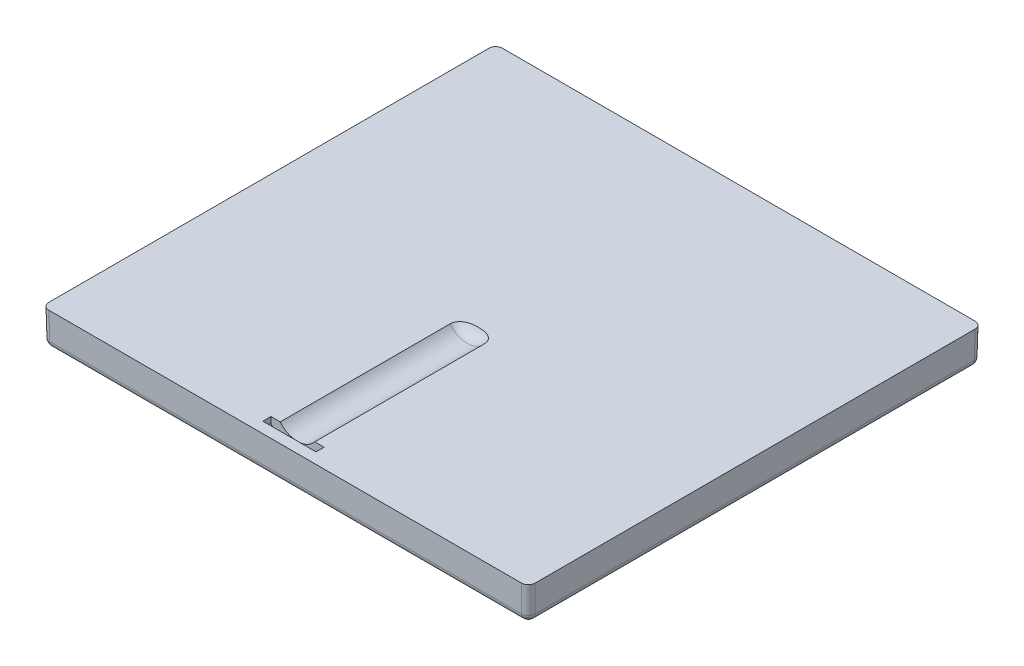
ISO-10303-21;
HEADER;
FILE_DESCRIPTION(('STEP AP214'),'2;1');
FILE_NAME('part.step','',(''),(''),'','','');
FILE_SCHEMA(('AUTOMOTIVE_DESIGN { 1 0 10303 214 1 1 1 1 }'));
ENDSEC;
DATA;
#1=APPLICATION_CONTEXT('core data for automotive mechanical design processes');
#2=APPLICATION_PROTOCOL_DEFINITION('international standard','automotive_design',2000,#1);
#3=PRODUCT_CONTEXT('',#1,'mechanical');
#4=PRODUCT('Part','Part','',(#3));
#5=PRODUCT_RELATED_PRODUCT_CATEGORY('part','',(#4));
#6=PRODUCT_DEFINITION_FORMATION('','',#4);
#7=PRODUCT_DEFINITION_CONTEXT('part definition',#1,'design');
#8=PRODUCT_DEFINITION('design','',#6,#7);
#9=PRODUCT_DEFINITION_SHAPE('','',#8);
#10=(LENGTH_UNIT() NAMED_UNIT(*) SI_UNIT(.MILLI.,.METRE.));
#11=(NAMED_UNIT(*) PLANE_ANGLE_UNIT() SI_UNIT($,.RADIAN.));
#12=(NAMED_UNIT(*) SI_UNIT($,.STERADIAN.) SOLID_ANGLE_UNIT());
#13=UNCERTAINTY_MEASURE_WITH_UNIT(LENGTH_MEASURE(1.E-05),#10,'distance_accuracy_value','');
#14=(GEOMETRIC_REPRESENTATION_CONTEXT(3) GLOBAL_UNCERTAINTY_ASSIGNED_CONTEXT((#13)) GLOBAL_UNIT_ASSIGNED_CONTEXT((#10,
#11,#12)) REPRESENTATION_CONTEXT('',''));
#15=CARTESIAN_POINT('',(0.,0.,0.));
#16=DIRECTION('',(0.,0.,1.));
#17=DIRECTION('',(1.,0.,0.));
#18=AXIS2_PLACEMENT_3D('',#15,#16,#17);
#19=CARTESIAN_POINT('',(0.,15.,0.));
#20=DIRECTION('',(0.,-1.,0.));
#21=DIRECTION('',(0.,0.,-1.));
#22=AXIS2_PLACEMENT_3D('',#19,#20,#21);
#23=PLANE('',#22);
#24=DIRECTION('',(1.,0.,0.));
#25=VECTOR('',#24,1.);
#26=CARTESIAN_POINT('',(0.,15.,-100.761825973923));
#27=LINE('',#26,#25);
#28=CARTESIAN_POINT('',(105.012282888454,15.,-100.761825973923));
#29=VERTEX_POINT('',#28);
#30=CARTESIAN_POINT('',(-105.012282888454,15.,-100.761825973923));
#31=VERTEX_POINT('',#30);
#32=EDGE_CURVE('E221',#29,#31,#27,.F.);
#33=ORIENTED_EDGE('',*,*,#32,.T.);
#34=CARTESIAN_POINT('',(-105.011368989792,15.,-97.7613689897915));
#35=DIRECTION('',(0.,-1.,0.));
#36=DIRECTION('',(0.707106781186548,0.,0.707106781186548));
#37=AXIS2_PLACEMENT_3D('',#34,#35,#36);
#38=ELLIPSE('',#37,3.00091389867315,3.);
#39=CARTESIAN_POINT('',(-108.011825973923,15.,-97.7622828884541));
#40=VERTEX_POINT('',#39);
#41=EDGE_CURVE('E259',#31,#40,#38,.F.);
#42=ORIENTED_EDGE('',*,*,#41,.T.);
#43=DIRECTION('',(0.,0.,-1.));
#44=VECTOR('',#43,1.);
#45=CARTESIAN_POINT('',(-108.011825973923,15.,0.));
#46=LINE('',#45,#44);
#47=CARTESIAN_POINT('',(-108.011825973923,15.,97.7622828884541));
#48=VERTEX_POINT('',#47);
#49=EDGE_CURVE('E225',#40,#48,#46,.F.);
#50=ORIENTED_EDGE('',*,*,#49,.T.);
#51=CARTESIAN_POINT('',(-105.011368989792,15.,97.7613689897916));
#52=DIRECTION('',(0.,-1.,0.));
#53=DIRECTION('',(0.707106781186548,0.,-0.707106781186548));
#54=AXIS2_PLACEMENT_3D('',#51,#52,#53);
#55=ELLIPSE('',#54,3.00091389867315,3.);
#56=CARTESIAN_POINT('',(-105.012282888454,15.,100.761825973923));
#57=VERTEX_POINT('',#56);
#58=EDGE_CURVE('E253',#48,#57,#55,.F.);
#59=ORIENTED_EDGE('',*,*,#58,.T.);
#60=DIRECTION('',(-1.,0.,0.));
#61=VECTOR('',#60,1.);
#62=CARTESIAN_POINT('',(0.,15.,100.761825973923));
#63=LINE('',#62,#61);
#64=CARTESIAN_POINT('',(105.012282888454,15.,100.761825973923));
#65=VERTEX_POINT('',#64);
#66=EDGE_CURVE('E228',#57,#65,#63,.F.);
#67=ORIENTED_EDGE('',*,*,#66,.T.);
#68=CARTESIAN_POINT('',(105.011368989792,15.,97.7613689897916));
#69=DIRECTION('',(0.,-1.,0.));
#70=DIRECTION('',(-0.707106781186548,0.,-0.707106781186548));
#71=AXIS2_PLACEMENT_3D('',#68,#69,#70);
#72=ELLIPSE('',#71,3.00091389867315,3.);
#73=CARTESIAN_POINT('',(108.011825973923,15.,97.7622828884541));
#74=VERTEX_POINT('',#73);
#75=EDGE_CURVE('E255',#65,#74,#72,.F.);
#76=ORIENTED_EDGE('',*,*,#75,.T.);
#77=DIRECTION('',(0.,0.,1.));
#78=VECTOR('',#77,1.);
#79=CARTESIAN_POINT('',(108.011825973923,15.,0.));
#80=LINE('',#79,#78);
#81=CARTESIAN_POINT('',(108.011825973923,15.,-97.7622828884541));
#82=VERTEX_POINT('',#81);
#83=EDGE_CURVE('E218',#74,#82,#80,.F.);
#84=ORIENTED_EDGE('',*,*,#83,.T.);
#85=CARTESIAN_POINT('',(105.011368989792,15.,-97.7613689897915));
#86=DIRECTION('',(0.,-1.,0.));
#87=DIRECTION('',(-0.707106781186548,0.,0.707106781186548));
#88=AXIS2_PLACEMENT_3D('',#85,#86,#87);
#89=ELLIPSE('',#88,3.00091389867315,3.);
#90=EDGE_CURVE('E257',#82,#29,#89,.F.);
#91=ORIENTED_EDGE('',*,*,#90,.T.);
#92=EDGE_LOOP('',(#33,#42,#50,#59,#67,#76,#84,#91));
#93=FACE_BOUND('',#92,.T.);
#94=DIRECTION('',(-1.,0.,0.));
#95=VECTOR('',#94,1.);
#96=CARTESIAN_POINT('',(0.,15.,92.3598238072773));
#97=LINE('',#96,#95);
#98=CARTESIAN_POINT('',(8.86054151823812,15.,92.3598238072773));
#99=VERTEX_POINT('',#98);
#100=CARTESIAN_POINT('',(4.71373386781985,15.,92.3598238072773));
#101=VERTEX_POINT('',#100);
#102=EDGE_CURVE('E11',#99,#101,#97,.T.);
#103=ORIENTED_EDGE('',*,*,#102,.F.);
#104=DIRECTION('',(0.,0.,-1.));
#105=VECTOR('',#104,1.);
#106=CARTESIAN_POINT('',(8.86054151823821,15.,0.));
#107=LINE('',#106,#105);
#108=CARTESIAN_POINT('',(8.86054151823812,15.,95.9298238072773));
#109=VERTEX_POINT('',#108);
#110=EDGE_CURVE('E310',#109,#99,#107,.T.);
#111=ORIENTED_EDGE('',*,*,#110,.F.);
#112=DIRECTION('',(-1.,0.,0.));
#113=VECTOR('',#112,1.);
#114=CARTESIAN_POINT('',(0.,15.,95.9298238072773));
#115=LINE('',#114,#113);
#116=CARTESIAN_POINT('',(-14.7644584817619,15.,95.9298238072772));
#117=VERTEX_POINT('',#116);
#118=EDGE_CURVE('E308',#109,#117,#115,.T.);
#119=ORIENTED_EDGE('',*,*,#118,.T.);
#120=DIRECTION('',(0.,0.,1.));
#121=VECTOR('',#120,1.);
#122=CARTESIAN_POINT('',(-14.7644584817618,15.,0.));
#123=LINE('',#122,#121);
#124=CARTESIAN_POINT('',(-14.7644584817619,15.,92.3598238072773));
#125=VERTEX_POINT('',#124);
#126=EDGE_CURVE('E170',#125,#117,#123,.T.);
#127=ORIENTED_EDGE('',*,*,#126,.F.);
#128=CARTESIAN_POINT('',(-10.6176508313436,15.,92.3598238072772));
#129=VERTEX_POINT('',#128);
#130=EDGE_CURVE('E47',#129,#125,#97,.T.);
#131=ORIENTED_EDGE('',*,*,#130,.F.);
#132=DIRECTION('',(0.,0.,-1.));
#133=VECTOR('',#132,1.);
#134=CARTESIAN_POINT('',(-10.6176508313435,15.,9.51235226495935));
#135=LINE('',#134,#133);
#136=CARTESIAN_POINT('',(-10.6176508313435,15.,16.9308080825));
#137=VERTEX_POINT('',#136);
#138=EDGE_CURVE('E305',#129,#137,#135,.T.);
#139=ORIENTED_EDGE('',*,*,#138,.T.);
#140=CARTESIAN_POINT('',(-2.95195848176181,15.,11.9296754535707));
#141=CARTESIAN_POINT('',(-2.79431894258142,15.,11.9296763348828));
#142=CARTESIAN_POINT('',(-2.6366804209323,15.,11.9315816788477));
#143=CARTESIAN_POINT('',(-2.32149308863841,15.,11.9393103763381));
#144=CARTESIAN_POINT('',(-2.16394428097352,15.,11.9451338531827));
#145=CARTESIAN_POINT('',(-1.84897882301656,15.,11.9610081069492));
#146=CARTESIAN_POINT('',(-1.69156226899235,15.,11.9710608596316));
#147=CARTESIAN_POINT('',(-1.37710376476,15.,11.9958872574424));
#148=CARTESIAN_POINT('',(-1.22006182796372,15.,12.0106610691101));
#149=CARTESIAN_POINT('',(-0.750709675648307,15.,12.0629011727345));
#150=CARTESIAN_POINT('',(-0.439199367883631,15.,12.1083278601685));
#151=CARTESIAN_POINT('',(0.17833625615687,15.,12.2266224152269));
#152=CARTESIAN_POINT('',(0.484367614252867,15.,12.2994578199985));
#153=CARTESIAN_POINT('',(1.09542288757707,15.,12.4821063947428));
#154=CARTESIAN_POINT('',(1.40015872755473,15.,12.5929332581364));
#155=CARTESIAN_POINT('',(1.84300865395335,15.,12.7910003325152));
#156=CARTESIAN_POINT('',(1.98830010150553,15.,12.8623590281029));
#157=CARTESIAN_POINT('',(2.27282473649055,15.,13.0162250241725));
#158=CARTESIAN_POINT('',(2.41206057197358,15.,13.0987273855184));
#159=CARTESIAN_POINT('',(2.68471777114792,15.,13.276322051727));
#160=CARTESIAN_POINT('',(2.81804746090716,15.,13.3715556897657));
#161=CARTESIAN_POINT('',(3.07533981860293,15.,13.5738480727472));
#162=CARTESIAN_POINT('',(3.19930741697665,15.,13.6809005192784));
#163=CARTESIAN_POINT('',(3.43618347158802,15.,13.9066118308448));
#164=CARTESIAN_POINT('',(3.54909376407961,15.,14.0252687621939));
#165=CARTESIAN_POINT('',(3.76208054171551,15.,14.2735985226301));
#166=CARTESIAN_POINT('',(3.86215956224103,15.,14.4032691670302));
#167=CARTESIAN_POINT('',(4.0359335067752,15.,14.65549205548));
#168=CARTESIAN_POINT('',(4.11136530966199,15.,14.7768493234994));
#169=CARTESIAN_POINT('',(4.25005788883109,15.,15.0263232682753));
#170=CARTESIAN_POINT('',(4.31332093985722,15.,15.1544386759942));
#171=CARTESIAN_POINT('',(4.42668165287631,15.,15.416259072217));
#172=CARTESIAN_POINT('',(4.47678932947434,15.,15.5499597185222));
#173=CARTESIAN_POINT('',(4.56309942788821,15.,15.821772832174));
#174=CARTESIAN_POINT('',(4.59930398029772,15.,15.9598846200156));
#175=CARTESIAN_POINT('',(4.65284029360923,15.,16.2179884453307));
#176=CARTESIAN_POINT('',(4.67219738134023,15.,16.3375643977274));
#177=CARTESIAN_POINT('',(4.70024464212918,15.,16.5780051386266));
#178=CARTESIAN_POINT('',(4.70893162637094,15.,16.6988703015362));
#179=CARTESIAN_POINT('',(4.71551550404964,15.,16.9408030792257));
#180=CARTESIAN_POINT('',(4.71342040219353,15.,17.0618704771275));
#181=CARTESIAN_POINT('',(4.69848331618409,15.,17.3033841021608));
#182=CARTESIAN_POINT('',(4.68563742082758,15.,17.4238300871706));
#183=CARTESIAN_POINT('',(4.65026367362728,15.,17.6570754317746));
#184=CARTESIAN_POINT('',(4.62825712427902,15.,17.7699539416243));
#185=CARTESIAN_POINT('',(4.57493850025328,15.,17.9935038263437));
#186=CARTESIAN_POINT('',(4.54362321034528,15.,18.1041744244857));
#187=CARTESIAN_POINT('',(4.43620068220537,15.,18.4316424082741));
#188=CARTESIAN_POINT('',(4.34657620597815,15.,18.644158552461));
#189=CARTESIAN_POINT('',(4.13228120187006,15.,19.0574529969159));
#190=CARTESIAN_POINT('',(4.00677051594731,15.,19.257790258984));
#191=CARTESIAN_POINT('',(3.72654727540496,15.,19.6369245866604));
#192=CARTESIAN_POINT('',(3.57181738892789,15.,19.8157087640432));
#193=CARTESIAN_POINT('',(3.22273595873922,15.,20.1650718094159));
#194=CARTESIAN_POINT('',(3.02602159082608,15.,20.3332772541423));
#195=CARTESIAN_POINT('',(2.61102233249258,15.,20.639943725502));
#196=CARTESIAN_POINT('',(2.39274924200111,15.,20.778420893294));
#197=CARTESIAN_POINT('',(1.98747833181015,15.,21.0011020736493));
#198=CARTESIAN_POINT('',(1.80333742566673,15.,21.0906081358818));
#199=CARTESIAN_POINT('',(1.42774744993643,15.,21.2528759136663));
#200=CARTESIAN_POINT('',(1.2362945764478,15.,21.3256287714711));
#201=CARTESIAN_POINT('',(0.847399144103133,15.,21.4561741670744));
#202=CARTESIAN_POINT('',(0.649932263302036,15.,21.5138932849888));
#203=CARTESIAN_POINT('',(0.251608446160163,15.,21.6157226344811));
#204=CARTESIAN_POINT('',(0.0507521439512803,15.,21.6598353825644));
#205=CARTESIAN_POINT('',(-0.3542204240542,15.,21.7365612604195));
#206=CARTESIAN_POINT('',(-0.558348392211187,15.,21.7691114905549));
#207=CARTESIAN_POINT('',(-0.967975629775368,15.,21.8242217812605));
#208=CARTESIAN_POINT('',(-1.17347525886168,15.,21.8467791078993));
#209=CARTESIAN_POINT('',(-1.58552166960543,15.,21.8834979223308));
#210=CARTESIAN_POINT('',(-1.7920695742779,15.,21.8976464726301));
#211=CARTESIAN_POINT('',(-2.20550589340889,15.,21.9186669746002));
#212=CARTESIAN_POINT('',(-2.41239427580059,15.,21.9255395761931));
#213=CARTESIAN_POINT('',(-2.82625558952535,15.,21.9326447116993));
#214=CARTESIAN_POINT('',(-3.03322850710463,15.,21.9328780731998));
#215=CARTESIAN_POINT('',(-3.44709473816147,15.,21.9267290223819));
#216=CARTESIAN_POINT('',(-3.65398804458152,15.,21.9203461184905));
#217=CARTESIAN_POINT('',(-4.06716190672501,15.,21.9003844267413));
#218=CARTESIAN_POINT('',(-4.27344291115844,15.,21.8868151893862));
#219=CARTESIAN_POINT('',(-4.68526773298736,15.,21.8513564245155));
#220=CARTESIAN_POINT('',(-4.89081169189079,15.,21.8294685911606));
#221=CARTESIAN_POINT('',(-5.28080718886298,15.,21.778413120785));
#222=CARTESIAN_POINT('',(-5.46537593891765,15.,21.7501543620474));
#223=CARTESIAN_POINT('',(-5.8328607488525,15.,21.6842423234113));
#224=CARTESIAN_POINT('',(-6.01577676091043,15.,21.6465887725692));
#225=CARTESIAN_POINT('',(-6.37875410777654,15.,21.5605540483776));
#226=CARTESIAN_POINT('',(-6.55881997735518,15.,21.5121922523558));
#227=CARTESIAN_POINT('',(-6.9152786043413,15.,21.4033217611929));
#228=CARTESIAN_POINT('',(-7.09167139593916,15.,21.3428131791744));
#229=CARTESIAN_POINT('',(-7.44207870901179,15.,21.207323938355));
#230=CARTESIAN_POINT('',(-7.61601115194006,15.,21.1321289893932));
#231=CARTESIAN_POINT('',(-7.95664205380478,15.,20.9668476917598));
#232=CARTESIAN_POINT('',(-8.12334276328333,15.,20.8767660184763));
#233=CARTESIAN_POINT('',(-8.44720932484698,15.,20.6810585388468));
#234=CARTESIAN_POINT('',(-8.60438341565628,15.,20.5754464422613));
#235=CARTESIAN_POINT('',(-8.90681842341352,15.,20.3483735045628));
#236=CARTESIAN_POINT('',(-9.05208545306804,15.,20.2269208795133));
#237=CARTESIAN_POINT('',(-9.28382377055844,15.,20.0099065859803));
#238=CARTESIAN_POINT('',(-9.3742234916558,15.,19.9185130237055));
#239=CARTESIAN_POINT('',(-9.54743957230865,15.,19.7288147355121));
#240=CARTESIAN_POINT('',(-9.63025783204565,15.,19.6305117523176));
#241=CARTESIAN_POINT('',(-9.78745779291097,15.,19.4273897366356));
#242=CARTESIAN_POINT('',(-9.8618406790515,15.,19.3225716226129));
#243=CARTESIAN_POINT('',(-10.0013301744914,15.,19.1069905422812));
#244=CARTESIAN_POINT('',(-10.0664409821083,15.,18.9962302979956));
#245=CARTESIAN_POINT('',(-10.1869862801794,15.,18.768779783421));
#246=CARTESIAN_POINT('',(-10.242366138049,15.,18.6520605013082));
#247=CARTESIAN_POINT('',(-10.3422962606869,15.,18.4141253456246));
#248=CARTESIAN_POINT('',(-10.3868511525954,15.,18.2929114189219));
#249=CARTESIAN_POINT('',(-10.464582505045,15.,18.046872070437));
#250=CARTESIAN_POINT('',(-10.4977580110823,15.,17.9220463466487));
#251=CARTESIAN_POINT('',(-10.5522746694519,15.,17.6698389891804));
#252=CARTESIAN_POINT('',(-10.5736167472339,15.,17.5424575561808));
#253=CARTESIAN_POINT('',(-10.6029026309231,15.,17.2969318701158));
#254=CARTESIAN_POINT('',(-10.6118145129133,15.,17.1789021557569));
#255=CARTESIAN_POINT('',(-10.6193492978091,15.,16.9424722778127));
#256=CARTESIAN_POINT('',(-10.6179688044132,15.,16.8240720048334));
#257=CARTESIAN_POINT('',(-10.6049299380558,15.,16.5879151718208));
#258=CARTESIAN_POINT('',(-10.5932780499183,15.,16.4701582527984));
#259=CARTESIAN_POINT('',(-10.5598370573748,15.,16.2360508972215));
#260=CARTESIAN_POINT('',(-10.5380442043616,15.,16.1197009971027));
#261=CARTESIAN_POINT('',(-10.4853323620148,15.,15.8925893676843));
#262=CARTESIAN_POINT('',(-10.4546920148694,15.,15.7817629666548));
#263=CARTESIAN_POINT('',(-10.3844125629675,15.,15.5629878836922));
#264=CARTESIAN_POINT('',(-10.3447703054281,15.,15.455040224832));
#265=CARTESIAN_POINT('',(-10.2129448304884,15.,15.1366272935334));
#266=CARTESIAN_POINT('',(-10.1078121017753,15.,14.9313764464862));
#267=CARTESIAN_POINT('',(-9.86226700717027,15.,14.5316247336583));
#268=CARTESIAN_POINT('',(-9.72057758874717,15.,14.3379172359589));
#269=CARTESIAN_POINT('',(-9.40967750880369,15.,13.9740871068394));
#270=CARTESIAN_POINT('',(-9.24045833537332,15.,13.8039718001075));
#271=CARTESIAN_POINT('',(-8.85999484268666,15.,13.4714502003898));
#272=CARTESIAN_POINT('',(-8.6461688939843,15.,13.3120141468053));
#273=CARTESIAN_POINT('',(-8.19859892447412,15.,13.0243056419687));
#274=CARTESIAN_POINT('',(-7.96484553076449,15.,12.8960479659653));
#275=CARTESIAN_POINT('',(-7.52083547948121,15.,12.6863348496725));
#276=CARTESIAN_POINT('',(-7.31250739350414,15.,12.6007131172284));
#277=CARTESIAN_POINT('',(-6.88895655918449,15.,12.448410796718));
#278=CARTESIAN_POINT('',(-6.67372944342463,15.,12.3817424815241));
#279=CARTESIAN_POINT('',(-6.23843689683568,15.,12.2649819057755));
#280=CARTESIAN_POINT('',(-6.01836250397696,15.,12.2149236848879));
#281=CARTESIAN_POINT('',(-5.57553979573199,15.,12.1290700652835));
#282=CARTESIAN_POINT('',(-5.35279191689783,15.,12.093272369754));
#283=CARTESIAN_POINT('',(-4.94899702784789,15.,12.039325266821));
#284=CARTESIAN_POINT('',(-4.76821762453247,15.,12.0191015570099));
#285=CARTESIAN_POINT('',(-4.40606201892197,15.,11.985295916053));
#286=CARTESIAN_POINT('',(-4.22468586929401,15.,11.9717134138073));
#287=CARTESIAN_POINT('',(-3.86149724026559,15.,11.9503344470299));
#288=CARTESIAN_POINT('',(-3.67968456988911,15.,11.9425413153337));
#289=CARTESIAN_POINT('',(-3.31590031485179,15.,11.9322111340689));
#290=CARTESIAN_POINT('',(-3.13392872037161,15.,11.9296744362336));
#291=CARTESIAN_POINT('',(-2.95195848176181,15.,11.9296754535707));
#292=B_SPLINE_CURVE_WITH_KNOTS('',3,(#140,#141,#142,#143,#144,#145,#146,#147,#148,#149,#150,
#151,#152,#153,#154,#155,#156,#157,#158,#159,#160,#161,#162,#163,#164,#165,#166,#167,#168,#169,
#170,#171,#172,#173,#174,#175,#176,#177,#178,#179,#180,#181,#182,#183,#184,#185,#186,#187,#188,
#189,#190,#191,#192,#193,#194,#195,#196,#197,#198,#199,#200,#201,#202,#203,#204,#205,#206,#207,
#208,#209,#210,#211,#212,#213,#214,#215,#216,#217,#218,#219,#220,#221,#222,#223,#224,#225,#226,
#227,#228,#229,#230,#231,#232,#233,#234,#235,#236,#237,#238,#239,#240,#241,#242,#243,#244,#245,
#246,#247,#248,#249,#250,#251,#252,#253,#254,#255,#256,#257,#258,#259,#260,#261,#262,#263,#264,
#265,#266,#267,#268,#269,#270,#271,#272,#273,#274,#275,#276,#277,#278,#279,#280,#281,#282,#283,
#284,#285,#286,#287,#288,#289,#290,#291),.UNSPECIFIED.,.T.,.F.,(4,2,2,2,2,2,2,2,2,2,2,2,2,2,2,2,
2,2,2,2,2,2,2,2,2,2,2,2,2,2,2,2,2,2,2,2,2,2,2,2,2,2,2,2,2,2,2,2,2,2,2,2,2,2,2,2,2,2,2,2,2,2,2,2,
2,2,2,2,2,2,2,2,2,2,2,4),(0.,0.472904454874449,0.945823794621698,1.41896431045221,
1.89212151854284,2.83551704784284,3.77779871948839,4.74748116529479,5.2326768377814,
5.71765816146408,6.20855696878517,6.69919542052992,7.18975225474178,7.68021200803222,
8.10824006075184,8.5361880228899,8.9638092563004,9.39136493242983,9.75430391160835,
10.1173513306274,10.4801292592387,10.8430392260387,11.1876353475864,11.5323506308941,
12.2209938774218,12.9273051832887,13.6340367730588,14.4075786290808,15.180699417353,
15.7940709879698,16.4077661193244,17.0244044053844,17.640928575379,18.2607570234941,
18.8807549442334,19.5017043223366,20.1225982296263,20.7434147415852,21.3642773820446,
21.9843169705905,22.6042303498187,23.1641846151375,23.7241550312699,24.2831203043851,
24.8420803721152,25.4099048041183,25.9775512404887,26.5446995519142,27.11155485971,
27.4968365747045,27.882021458608,28.2671521640335,28.6521079272958,29.039160317001,
29.4260469686248,29.8129660644048,30.1998548963711,30.5545123365306,30.9092868125403,
31.263837462705,31.6185192767436,31.9630637219204,32.3077290252001,32.9964029616455,
33.7135017159207,34.4308226124299,35.2280582641749,36.0256709878724,36.700395890997,
37.3755567075542,38.0520927310071,38.7285197468734,39.2741106978703,39.8196547233962,
40.3655125658525,40.9114069330941),.UNSPECIFIED.);
#293=CARTESIAN_POINT('',(4.71373386781991,15.,16.9308080825));
#294=VERTEX_POINT('',#293);
#295=EDGE_CURVE('E311',#137,#294,#292,.T.);
#296=ORIENTED_EDGE('',*,*,#295,.T.);
#297=DIRECTION('',(0.,0.,-1.));
#298=VECTOR('',#297,1.);
#299=CARTESIAN_POINT('',(4.71373386781992,15.,9.51235226495937));
#300=LINE('',#299,#298);
#301=EDGE_CURVE('E41',#294,#101,#300,.F.);
#302=ORIENTED_EDGE('',*,*,#301,.T.);
#303=EDGE_LOOP('',(#103,#111,#119,#127,#131,#139,#296,#302));
#304=FACE_BOUND('',#303,.T.);
#305=ADVANCED_FACE('F37',(#93,#304),#23,.F.);
#306=CARTESIAN_POINT('',(107.75,0.,100.5));
#307=DIRECTION('',(0.999847695156391,-0.0174524064372835,0.));
#308=DIRECTION('',(0.0174524064372835,0.999847695156391,0.));
#309=AXIS2_PLACEMENT_3D('',#306,#307,#308);
#310=PLANE('',#309);
#311=DIRECTION('',(0.,0.,-1.));
#312=VECTOR('',#311,1.);
#313=CARTESIAN_POINT('',(107.801451296122,2.94764278068815,-100.5));
#314=LINE('',#313,#312);
#315=CARTESIAN_POINT('',(107.801451296122,2.94764278068815,97.551908210653));
#316=VERTEX_POINT('',#315);
#317=CARTESIAN_POINT('',(107.801451296122,2.94764278068815,-97.5519082106529));
#318=VERTEX_POINT('',#317);
#319=EDGE_CURVE('E263',#316,#318,#314,.T.);
#320=ORIENTED_EDGE('',*,*,#319,.T.);
#321=DIRECTION('',(0.0174497491606827,0.999695459881888,-0.0174497491606827));
#322=VECTOR('',#321,1.);
#323=CARTESIAN_POINT('',(107.68971009921,-3.45400610299427,-97.4401670137406));
#324=LINE('',#323,#322);
#325=EDGE_CURVE('E265',#318,#82,#324,.T.);
#326=ORIENTED_EDGE('',*,*,#325,.T.);
#327=ORIENTED_EDGE('',*,*,#83,.F.);
#328=DIRECTION('',(0.0174497491606827,0.999695459881888,0.0174497491606827));
#329=VECTOR('',#328,1.);
#330=CARTESIAN_POINT('',(107.75091334211,0.0523253344201977,97.5013702566405));
#331=LINE('',#330,#329);
#332=EDGE_CURVE('E261',#74,#316,#331,.F.);
#333=ORIENTED_EDGE('',*,*,#332,.T.);
#334=EDGE_LOOP('',(#320,#326,#327,#333));
#335=FACE_BOUND('',#334,.T.);
#336=ADVANCED_FACE('F353',(#335),#310,.T.);
#337=CARTESIAN_POINT('',(-107.75,0.,-100.5));
#338=DIRECTION('',(0.,-0.0174524064372835,-0.999847695156391));
#339=DIRECTION('',(0.,0.999847695156391,-0.0174524064372835));
#340=AXIS2_PLACEMENT_3D('',#337,#338,#339);
#341=PLANE('',#340);
#342=DIRECTION('',(-1.,0.,0.));
#343=VECTOR('',#342,1.);
#344=CARTESIAN_POINT('',(-107.75,2.94764278068815,-100.551451296122));
#345=LINE('',#344,#343);
#346=CARTESIAN_POINT('',(104.801908210653,2.94764278068815,-100.551451296122));
#347=VERTEX_POINT('',#346);
#348=CARTESIAN_POINT('',(-104.801908210653,2.94764278068815,-100.551451296122));
#349=VERTEX_POINT('',#348);
#350=EDGE_CURVE('E233',#347,#349,#345,.T.);
#351=ORIENTED_EDGE('',*,*,#350,.T.);
#352=DIRECTION('',(-0.0174497491606827,0.999695459881888,-0.0174497491606827));
#353=VECTOR('',#352,1.);
#354=CARTESIAN_POINT('',(-104.751370256641,0.0523253344201977,-100.50091334211));
#355=LINE('',#354,#353);
#356=EDGE_CURVE('E236',#349,#31,#355,.T.);
#357=ORIENTED_EDGE('',*,*,#356,.T.);
#358=ORIENTED_EDGE('',*,*,#32,.F.);
#359=DIRECTION('',(0.0174497491606827,0.999695459881888,-0.0174497491606827));
#360=VECTOR('',#359,1.);
#361=CARTESIAN_POINT('',(104.685751854427,-3.70695041066845,-100.435294939896));
#362=LINE('',#361,#360);
#363=EDGE_CURVE('E231',#29,#347,#362,.F.);
#364=ORIENTED_EDGE('',*,*,#363,.T.);
#365=EDGE_LOOP('',(#351,#357,#358,#364));
#366=FACE_BOUND('',#365,.T.);
#367=ADVANCED_FACE('F360',(#366),#341,.T.);
#368=CARTESIAN_POINT('',(-107.75,0.,100.5));
#369=DIRECTION('',(-0.999847695156391,-0.0174524064372835,0.));
#370=DIRECTION('',(0.0174524064372835,-0.999847695156391,0.));
#371=AXIS2_PLACEMENT_3D('',#368,#369,#370);
#372=PLANE('',#371);
#373=ORIENTED_EDGE('',*,*,#49,.F.);
#374=DIRECTION('',(-0.0174497491606827,0.999695459881888,-0.0174497491606827));
#375=VECTOR('',#374,1.);
#376=CARTESIAN_POINT('',(-107.68971009921,-3.45400610299427,-97.4401670137405));
#377=LINE('',#376,#375);
#378=CARTESIAN_POINT('',(-107.801451296122,2.94764278068815,-97.5519082106529));
#379=VERTEX_POINT('',#378);
#380=EDGE_CURVE('E251',#40,#379,#377,.F.);
#381=ORIENTED_EDGE('',*,*,#380,.T.);
#382=DIRECTION('',(0.,0.,1.));
#383=VECTOR('',#382,1.);
#384=CARTESIAN_POINT('',(-107.801451296122,2.94764278068815,100.5));
#385=LINE('',#384,#383);
#386=CARTESIAN_POINT('',(-107.801451296122,2.94764278068815,97.551908210653));
#387=VERTEX_POINT('',#386);
#388=EDGE_CURVE('E249',#379,#387,#385,.T.);
#389=ORIENTED_EDGE('',*,*,#388,.T.);
#390=DIRECTION('',(-0.0174497491606827,0.999695459881888,0.0174497491606827));
#391=VECTOR('',#390,1.);
#392=CARTESIAN_POINT('',(-107.75091334211,0.0523253344201977,97.5013702566405));
#393=LINE('',#392,#391);
#394=EDGE_CURVE('E247',#387,#48,#393,.T.);
#395=ORIENTED_EDGE('',*,*,#394,.T.);
#396=EDGE_LOOP('',(#373,#381,#389,#395));
#397=FACE_BOUND('',#396,.T.);
#398=ADVANCED_FACE('F387',(#397),#372,.T.);
#399=CARTESIAN_POINT('',(-107.75,0.,100.5));
#400=DIRECTION('',(0.,-0.0174524064372835,0.999847695156391));
#401=DIRECTION('',(0.,-0.999847695156391,-0.0174524064372835));
#402=AXIS2_PLACEMENT_3D('',#399,#400,#401);
#403=PLANE('',#402);
#404=DIRECTION('',(1.,0.,0.));
#405=VECTOR('',#404,1.);
#406=CARTESIAN_POINT('',(107.75,2.94764278068815,100.551451296122));
#407=LINE('',#406,#405);
#408=CARTESIAN_POINT('',(-104.801908210653,2.94764278068815,100.551451296122));
#409=VERTEX_POINT('',#408);
#410=CARTESIAN_POINT('',(104.801908210653,2.94764278068815,100.551451296122));
#411=VERTEX_POINT('',#410);
#412=EDGE_CURVE('E61',#409,#411,#407,.T.);
#413=ORIENTED_EDGE('',*,*,#412,.T.);
#414=DIRECTION('',(0.0174497491606827,0.999695459881888,0.0174497491606827));
#415=VECTOR('',#414,1.);
#416=CARTESIAN_POINT('',(104.685751854427,-3.70695041066845,100.435294939896));
#417=LINE('',#416,#415);
#418=EDGE_CURVE('E270',#411,#65,#417,.T.);
#419=ORIENTED_EDGE('',*,*,#418,.T.);
#420=ORIENTED_EDGE('',*,*,#66,.F.);
#421=DIRECTION('',(-0.0174497491606827,0.999695459881888,0.0174497491606827));
#422=VECTOR('',#421,1.);
#423=CARTESIAN_POINT('',(-104.751370256641,0.0523253344201977,100.50091334211));
#424=LINE('',#423,#422);
#425=EDGE_CURVE('E267',#57,#409,#424,.F.);
#426=ORIENTED_EDGE('',*,*,#425,.T.);
#427=EDGE_LOOP('',(#413,#419,#420,#426));
#428=FACE_BOUND('',#427,.T.);
#429=ADVANCED_FACE('F405',(#428),#403,.T.);
#430=CARTESIAN_POINT('',(0.,0.,0.));
#431=DIRECTION('',(0.,-1.,0.));
#432=DIRECTION('',(0.,0.,-1.));
#433=AXIS2_PLACEMENT_3D('',#430,#431,#432);
#434=PLANE('',#433);
#435=DIRECTION('',(0.,0.,-1.));
#436=VECTOR('',#435,1.);
#437=CARTESIAN_POINT('',(-104.801908210653,0.,-100.5));
#438=LINE('',#437,#436);
#439=CARTESIAN_POINT('',(-104.801908210653,0.,97.551908210653));
#440=VERTEX_POINT('',#439);
#441=CARTESIAN_POINT('',(-104.801908210653,0.,-97.5519082106529));
#442=VERTEX_POINT('',#441);
#443=EDGE_CURVE('E240',#440,#442,#438,.T.);
#444=ORIENTED_EDGE('',*,*,#443,.T.);
#445=DIRECTION('',(1.,0.,0.));
#446=VECTOR('',#445,1.);
#447=CARTESIAN_POINT('',(107.75,0.,-97.5519082106529));
#448=LINE('',#447,#446);
#449=CARTESIAN_POINT('',(104.801908210653,0.,-97.5519082106529));
#450=VERTEX_POINT('',#449);
#451=EDGE_CURVE('E244',#442,#450,#448,.T.);
#452=ORIENTED_EDGE('',*,*,#451,.T.);
#453=DIRECTION('',(0.,0.,1.));
#454=VECTOR('',#453,1.);
#455=CARTESIAN_POINT('',(104.801908210653,0.,100.5));
#456=LINE('',#455,#454);
#457=CARTESIAN_POINT('',(104.801908210653,0.,97.551908210653));
#458=VERTEX_POINT('',#457);
#459=EDGE_CURVE('E242',#450,#458,#456,.T.);
#460=ORIENTED_EDGE('',*,*,#459,.T.);
#461=DIRECTION('',(-1.,0.,0.));
#462=VECTOR('',#461,1.);
#463=CARTESIAN_POINT('',(-107.75,0.,97.551908210653));
#464=LINE('',#463,#462);
#465=EDGE_CURVE('E238',#458,#440,#464,.T.);
#466=ORIENTED_EDGE('',*,*,#465,.T.);
#467=EDGE_LOOP('',(#444,#452,#460,#466));
#468=FACE_BOUND('',#467,.T.);
#469=ADVANCED_FACE('F461',(#468),#434,.T.);
#470=CARTESIAN_POINT('',(104.75137025664,0.104682553732048,97.5013702566405));
#471=DIRECTION('',(-0.0174497491606827,-0.999695459881887,-0.0174497491606827));
#472=DIRECTION('',(0.,0.0174524064372835,-0.999847695156391));
#473=AXIS2_PLACEMENT_3D('',#470,#471,#472);
#474=CYLINDRICAL_SURFACE('',#473,3.);
#475=ORIENTED_EDGE('',*,*,#75,.F.);
#476=ORIENTED_EDGE('',*,*,#418,.F.);
#477=CARTESIAN_POINT('',(104.801908210653,3.,97.551908210653));
#478=DIRECTION('',(-0.0174497491606828,-0.999695459881888,-0.0174497491606828));
#479=DIRECTION('',(0.,0.0174524064372836,-0.999847695156391));
#480=AXIS2_PLACEMENT_3D('',#477,#478,#479);
#481=CIRCLE('',#480,3.);
#482=EDGE_CURVE('E299',#316,#411,#481,.T.);
#483=ORIENTED_EDGE('',*,*,#482,.F.);
#484=ORIENTED_EDGE('',*,*,#332,.F.);
#485=EDGE_LOOP('',(#475,#476,#483,#484));
#486=FACE_BOUND('',#485,.T.);
#487=ADVANCED_FACE('F39',(#486),#474,.T.);
#488=CARTESIAN_POINT('',(-104.751370256641,0.104682553732048,97.5013702566405));
#489=DIRECTION('',(0.0174497491606827,-0.999695459881887,-0.0174497491606827));
#490=DIRECTION('',(0.,0.0174524064372835,-0.999847695156391));
#491=AXIS2_PLACEMENT_3D('',#488,#489,#490);
#492=CYLINDRICAL_SURFACE('',#491,3.);
#493=ORIENTED_EDGE('',*,*,#58,.F.);
#494=ORIENTED_EDGE('',*,*,#394,.F.);
#495=CARTESIAN_POINT('',(-104.801908210653,3.,97.551908210653));
#496=DIRECTION('',(0.0174497491606828,-0.999695459881888,-0.0174497491606828));
#497=DIRECTION('',(0.,0.0174524064372836,-0.999847695156391));
#498=AXIS2_PLACEMENT_3D('',#495,#496,#497);
#499=CIRCLE('',#498,3.);
#500=EDGE_CURVE('E296',#409,#387,#499,.T.);
#501=ORIENTED_EDGE('',*,*,#500,.F.);
#502=ORIENTED_EDGE('',*,*,#425,.F.);
#503=EDGE_LOOP('',(#493,#494,#501,#502));
#504=FACE_BOUND('',#503,.T.);
#505=ADVANCED_FACE('F402',(#504),#492,.T.);
#506=CARTESIAN_POINT('',(-107.75,3.,97.551908210653));
#507=DIRECTION('',(1.,0.,0.));
#508=DIRECTION('',(0.,0.,-1.));
#509=AXIS2_PLACEMENT_3D('',#506,#507,#508);
#510=CYLINDRICAL_SURFACE('',#509,3.);
#511=CARTESIAN_POINT('',(104.801908210653,3.,97.551908210653));
#512=DIRECTION('',(1.,0.,0.));
#513=DIRECTION('',(0.,0.,-1.));
#514=AXIS2_PLACEMENT_3D('',#511,#512,#513);
#515=CIRCLE('',#514,3.);
#516=EDGE_CURVE('E222',#411,#458,#515,.T.);
#517=ORIENTED_EDGE('',*,*,#516,.F.);
#518=ORIENTED_EDGE('',*,*,#412,.F.);
#519=CARTESIAN_POINT('',(-104.801908210653,3.,97.551908210653));
#520=DIRECTION('',(-1.,0.,0.));
#521=DIRECTION('',(0.,0.,1.));
#522=AXIS2_PLACEMENT_3D('',#519,#520,#521);
#523=CIRCLE('',#522,3.);
#524=EDGE_CURVE('E293',#440,#409,#523,.T.);
#525=ORIENTED_EDGE('',*,*,#524,.F.);
#526=ORIENTED_EDGE('',*,*,#465,.F.);
#527=EDGE_LOOP('',(#517,#518,#525,#526));
#528=FACE_BOUND('',#527,.T.);
#529=ADVANCED_FACE('F413',(#528),#510,.T.);
#530=CARTESIAN_POINT('',(104.801908210653,3.,97.551908210653));
#531=DIRECTION('',(0.,-1.,0.));
#532=DIRECTION('',(0.,0.,-1.));
#533=AXIS2_PLACEMENT_3D('',#530,#531,#532);
#534=SPHERICAL_SURFACE('',#533,3.);
#535=ORIENTED_EDGE('',*,*,#482,.T.);
#536=ORIENTED_EDGE('',*,*,#516,.T.);
#537=CARTESIAN_POINT('',(104.801908210653,3.,97.551908210653));
#538=DIRECTION('',(0.,0.,1.));
#539=DIRECTION('',(1.,0.,0.));
#540=AXIS2_PLACEMENT_3D('',#537,#538,#539);
#541=CIRCLE('',#540,3.);
#542=EDGE_CURVE('E290',#316,#458,#541,.F.);
#543=ORIENTED_EDGE('',*,*,#542,.F.);
#544=EDGE_LOOP('',(#535,#536,#543));
#545=FACE_BOUND('',#544,.T.);
#546=ADVANCED_FACE('F415',(#545),#534,.T.);
#547=CARTESIAN_POINT('',(-104.801908210653,3.,97.551908210653));
#548=DIRECTION('',(0.,-1.,0.));
#549=DIRECTION('',(0.,0.,-1.));
#550=AXIS2_PLACEMENT_3D('',#547,#548,#549);
#551=SPHERICAL_SURFACE('',#550,3.);
#552=ORIENTED_EDGE('',*,*,#524,.T.);
#553=ORIENTED_EDGE('',*,*,#500,.T.);
#554=CARTESIAN_POINT('',(-104.801908210653,3.,97.551908210653));
#555=DIRECTION('',(0.,0.,1.));
#556=DIRECTION('',(1.,0.,0.));
#557=AXIS2_PLACEMENT_3D('',#554,#555,#556);
#558=CIRCLE('',#557,3.);
#559=EDGE_CURVE('E287',#440,#387,#558,.F.);
#560=ORIENTED_EDGE('',*,*,#559,.F.);
#561=EDGE_LOOP('',(#552,#553,#560));
#562=FACE_BOUND('',#561,.T.);
#563=ADVANCED_FACE('F396',(#562),#551,.T.);
#564=CARTESIAN_POINT('',(104.801908210653,3.,100.5));
#565=DIRECTION('',(0.,0.,-1.));
#566=DIRECTION('',(-1.,0.,0.));
#567=AXIS2_PLACEMENT_3D('',#564,#565,#566);
#568=CYLINDRICAL_SURFACE('',#567,3.);
#569=ORIENTED_EDGE('',*,*,#542,.T.);
#570=ORIENTED_EDGE('',*,*,#459,.F.);
#571=CARTESIAN_POINT('',(104.801908210653,3.,-97.5519082106529));
#572=DIRECTION('',(0.,0.,-1.));
#573=DIRECTION('',(0.,1.,0.));
#574=AXIS2_PLACEMENT_3D('',#571,#572,#573);
#575=CIRCLE('',#574,3.);
#576=EDGE_CURVE('E284',#318,#450,#575,.T.);
#577=ORIENTED_EDGE('',*,*,#576,.F.);
#578=ORIENTED_EDGE('',*,*,#319,.F.);
#579=EDGE_LOOP('',(#569,#570,#577,#578));
#580=FACE_BOUND('',#579,.T.);
#581=ADVANCED_FACE('F420',(#580),#568,.T.);
#582=CARTESIAN_POINT('',(104.685751854427,-3.6545931913566,-97.4357518544269));
#583=DIRECTION('',(-0.0174497491606827,-0.999695459881887,0.0174497491606827));
#584=DIRECTION('',(0.,-0.0174524064372835,-0.999847695156391));
#585=AXIS2_PLACEMENT_3D('',#582,#583,#584);
#586=CYLINDRICAL_SURFACE('',#585,3.);
#587=ORIENTED_EDGE('',*,*,#90,.F.);
#588=ORIENTED_EDGE('',*,*,#325,.F.);
#589=CARTESIAN_POINT('',(104.801908210653,3.,-97.5519082106529));
#590=DIRECTION('',(-0.017449749160683,-0.999695459881888,0.0174497491606828));
#591=DIRECTION('',(0.999847695156391,-0.0174524064372838,0.));
#592=AXIS2_PLACEMENT_3D('',#589,#590,#591);
#593=CIRCLE('',#592,3.);
#594=EDGE_CURVE('E281',#347,#318,#593,.T.);
#595=ORIENTED_EDGE('',*,*,#594,.F.);
#596=ORIENTED_EDGE('',*,*,#363,.F.);
#597=EDGE_LOOP('',(#587,#588,#595,#596));
#598=FACE_BOUND('',#597,.T.);
#599=ADVANCED_FACE('F425',(#598),#586,.T.);
#600=CARTESIAN_POINT('',(-104.690167013741,-3.40164888368242,-97.4401670137406));
#601=DIRECTION('',(0.0174497491606827,-0.999695459881887,0.0174497491606827));
#602=DIRECTION('',(0.,-0.0174524064372835,-0.999847695156391));
#603=AXIS2_PLACEMENT_3D('',#600,#601,#602);
#604=CYLINDRICAL_SURFACE('',#603,3.);
#605=ORIENTED_EDGE('',*,*,#41,.F.);
#606=ORIENTED_EDGE('',*,*,#356,.F.);
#607=CARTESIAN_POINT('',(-104.801908210653,3.,-97.5519082106529));
#608=DIRECTION('',(0.0174497491606828,-0.999695459881887,0.0174497491606826));
#609=DIRECTION('',(0.999847695156391,0.0174524064372836,0.));
#610=AXIS2_PLACEMENT_3D('',#607,#608,#609);
#611=CIRCLE('',#610,3.);
#612=EDGE_CURVE('E278',#379,#349,#611,.T.);
#613=ORIENTED_EDGE('',*,*,#612,.F.);
#614=ORIENTED_EDGE('',*,*,#380,.F.);
#615=EDGE_LOOP('',(#605,#606,#613,#614));
#616=FACE_BOUND('',#615,.T.);
#617=ADVANCED_FACE('F383',(#616),#604,.T.);
#618=CARTESIAN_POINT('',(-104.801908210653,3.,100.5));
#619=DIRECTION('',(0.,0.,1.));
#620=DIRECTION('',(1.,0.,0.));
#621=AXIS2_PLACEMENT_3D('',#618,#619,#620);
#622=CYLINDRICAL_SURFACE('',#621,3.);
#623=ORIENTED_EDGE('',*,*,#559,.T.);
#624=ORIENTED_EDGE('',*,*,#388,.F.);
#625=CARTESIAN_POINT('',(-104.801908210653,3.,-97.5519082106529));
#626=DIRECTION('',(0.,0.,-1.));
#627=DIRECTION('',(-1.,0.,0.));
#628=AXIS2_PLACEMENT_3D('',#625,#626,#627);
#629=CIRCLE('',#628,3.);
#630=EDGE_CURVE('E275',#442,#379,#629,.T.);
#631=ORIENTED_EDGE('',*,*,#630,.F.);
#632=ORIENTED_EDGE('',*,*,#443,.F.);
#633=EDGE_LOOP('',(#623,#624,#631,#632));
#634=FACE_BOUND('',#633,.T.);
#635=ADVANCED_FACE('F391',(#634),#622,.T.);
#636=CARTESIAN_POINT('',(104.801908210653,3.,-97.5519082106529));
#637=DIRECTION('',(0.,-1.,0.));
#638=DIRECTION('',(0.,0.,-1.));
#639=AXIS2_PLACEMENT_3D('',#636,#637,#638);
#640=SPHERICAL_SURFACE('',#639,3.);
#641=ORIENTED_EDGE('',*,*,#594,.T.);
#642=ORIENTED_EDGE('',*,*,#576,.T.);
#643=CARTESIAN_POINT('',(104.801908210653,3.,-97.5519082106529));
#644=DIRECTION('',(1.,0.,0.));
#645=DIRECTION('',(0.,0.,-1.));
#646=AXIS2_PLACEMENT_3D('',#643,#644,#645);
#647=CIRCLE('',#646,3.);
#648=EDGE_CURVE('E273',#347,#450,#647,.F.);
#649=ORIENTED_EDGE('',*,*,#648,.F.);
#650=EDGE_LOOP('',(#641,#642,#649));
#651=FACE_BOUND('',#650,.T.);
#652=ADVANCED_FACE('F433',(#651),#640,.T.);
#653=CARTESIAN_POINT('',(-104.801908210653,3.,-97.5519082106529));
#654=DIRECTION('',(0.,-1.,0.));
#655=DIRECTION('',(0.,0.,-1.));
#656=AXIS2_PLACEMENT_3D('',#653,#654,#655);
#657=SPHERICAL_SURFACE('',#656,3.);
#658=ORIENTED_EDGE('',*,*,#630,.T.);
#659=ORIENTED_EDGE('',*,*,#612,.T.);
#660=CARTESIAN_POINT('',(-104.801908210653,3.,-97.5519082106529));
#661=DIRECTION('',(-1.,0.,0.));
#662=DIRECTION('',(0.,0.,1.));
#663=AXIS2_PLACEMENT_3D('',#660,#661,#662);
#664=CIRCLE('',#663,3.);
#665=EDGE_CURVE('E217',#442,#349,#664,.F.);
#666=ORIENTED_EDGE('',*,*,#665,.F.);
#667=EDGE_LOOP('',(#658,#659,#666));
#668=FACE_BOUND('',#667,.T.);
#669=ADVANCED_FACE('F431',(#668),#657,.T.);
#670=CARTESIAN_POINT('',(-107.75,3.,-97.5519082106529));
#671=DIRECTION('',(-1.,0.,0.));
#672=DIRECTION('',(0.,0.,1.));
#673=AXIS2_PLACEMENT_3D('',#670,#671,#672);
#674=CYLINDRICAL_SURFACE('',#673,3.);
#675=ORIENTED_EDGE('',*,*,#648,.T.);
#676=ORIENTED_EDGE('',*,*,#451,.F.);
#677=ORIENTED_EDGE('',*,*,#665,.T.);
#678=ORIENTED_EDGE('',*,*,#350,.F.);
#679=EDGE_LOOP('',(#675,#676,#677,#678));
#680=FACE_BOUND('',#679,.T.);
#681=ADVANCED_FACE('F328',(#680),#674,.T.);
#682=CARTESIAN_POINT('',(-2.9519584817618,21.2172390014833,9.51235226495936));
#683=DIRECTION('',(0.,0.,-1.));
#684=DIRECTION('',(1.,0.,0.));
#685=AXIS2_PLACEMENT_3D('',#682,#683,#684);
#686=CYLINDRICAL_SURFACE('',#685,9.87000000000002);
#687=CARTESIAN_POINT('',(-2.95195848176188,21.2172390014833,92.3598238072773));
#688=DIRECTION('',(0.,0.,-1.));
#689=DIRECTION('',(1.,0.,0.));
#690=AXIS2_PLACEMENT_3D('',#687,#688,#689);
#691=CIRCLE('',#690,9.87000000000003);
#692=EDGE_CURVE('E53',#101,#129,#691,.T.);
#693=ORIENTED_EDGE('',*,*,#692,.F.);
#694=ORIENTED_EDGE('',*,*,#301,.F.);
#695=CARTESIAN_POINT('',(-2.95195848176181,21.2172390014833,16.9308080825));
#696=DIRECTION('',(0.,0.,-1.));
#697=DIRECTION('',(1.,0.,0.));
#698=AXIS2_PLACEMENT_3D('',#695,#696,#697);
#699=CIRCLE('',#698,9.87000000000002);
#700=EDGE_CURVE('E214',#137,#294,#699,.F.);
#701=ORIENTED_EDGE('',*,*,#700,.F.);
#702=ORIENTED_EDGE('',*,*,#138,.F.);
#703=EDGE_LOOP('',(#693,#694,#701,#702));
#704=FACE_BOUND('',#703,.T.);
#705=ADVANCED_FACE('F324',(#704),#686,.F.);
#706=CARTESIAN_POINT('',(-2.95195848176181,21.2172390014833,16.9308080825));
#707=DIRECTION('',(0.,0.,-1.));
#708=DIRECTION('',(1.,0.,0.));
#709=AXIS2_PLACEMENT_3D('',#706,#707,#708);
#710=DEGENERATE_TOROIDAL_SURFACE('',#709,4.62000000000002,5.25,.T.);
#711=ORIENTED_EDGE('',*,*,#700,.T.);
#712=ORIENTED_EDGE('',*,*,#295,.F.);
#713=EDGE_LOOP('',(#711,#712));
#714=FACE_BOUND('',#713,.T.);
#715=ADVANCED_FACE('F320',(#714),#710,.F.);
#716=CARTESIAN_POINT('',(-14.7644584817619,30.0372390014833,95.9298238072772));
#717=DIRECTION('',(1.,0.,0.));
#718=DIRECTION('',(0.,-1.,0.));
#719=AXIS2_PLACEMENT_3D('',#716,#717,#718);
#720=PLANE('',#719);
#721=ORIENTED_EDGE('',*,*,#126,.T.);
#722=DIRECTION('',(0.,-1.,0.));
#723=VECTOR('',#722,1.);
#724=CARTESIAN_POINT('',(-14.7644584817619,30.0372390014833,95.9298238072772));
#725=LINE('',#724,#723);
#726=CARTESIAN_POINT('',(-14.7644584817619,12.3972390014833,95.9298238072772));
#727=VERTEX_POINT('',#726);
#728=EDGE_CURVE('E163',#117,#727,#725,.T.);
#729=ORIENTED_EDGE('',*,*,#728,.T.);
#730=DIRECTION('',(0.,0.,-1.));
#731=VECTOR('',#730,1.);
#732=CARTESIAN_POINT('',(-14.7644584817619,12.3972390014833,95.9298238072772));
#733=LINE('',#732,#731);
#734=CARTESIAN_POINT('',(-14.7644584817619,12.3972390014833,92.3598238072773));
#735=VERTEX_POINT('',#734);
#736=EDGE_CURVE('E167',#727,#735,#733,.T.);
#737=ORIENTED_EDGE('',*,*,#736,.T.);
#738=DIRECTION('',(0.,-1.,0.));
#739=VECTOR('',#738,1.);
#740=CARTESIAN_POINT('',(-14.7644584817619,30.0372390014833,92.3598238072773));
#741=LINE('',#740,#739);
#742=EDGE_CURVE('E198',#125,#735,#741,.T.);
#743=ORIENTED_EDGE('',*,*,#742,.F.);
#744=EDGE_LOOP('',(#721,#729,#737,#743));
#745=FACE_BOUND('',#744,.T.);
#746=ADVANCED_FACE('F165',(#745),#720,.T.);
#747=CARTESIAN_POINT('',(8.86054151823811,30.0372390014833,95.9298238072773));
#748=DIRECTION('',(-1.,0.,0.));
#749=DIRECTION('',(0.,1.,0.));
#750=AXIS2_PLACEMENT_3D('',#747,#748,#749);
#751=PLANE('',#750);
#752=ORIENTED_EDGE('',*,*,#110,.T.);
#753=DIRECTION('',(0.,1.,0.));
#754=VECTOR('',#753,1.);
#755=CARTESIAN_POINT('',(8.86054151823811,30.0372390014833,92.3598238072773));
#756=LINE('',#755,#754);
#757=CARTESIAN_POINT('',(8.86054151823813,12.3972390014833,92.3598238072773));
#758=VERTEX_POINT('',#757);
#759=EDGE_CURVE('E175',#758,#99,#756,.T.);
#760=ORIENTED_EDGE('',*,*,#759,.F.);
#761=DIRECTION('',(0.,0.,-1.));
#762=VECTOR('',#761,1.);
#763=CARTESIAN_POINT('',(8.86054151823812,12.3972390014833,95.9298238072773));
#764=LINE('',#763,#762);
#765=CARTESIAN_POINT('',(8.86054151823812,12.3972390014833,95.9298238072773));
#766=VERTEX_POINT('',#765);
#767=EDGE_CURVE('E197',#766,#758,#764,.T.);
#768=ORIENTED_EDGE('',*,*,#767,.F.);
#769=DIRECTION('',(0.,1.,0.));
#770=VECTOR('',#769,1.);
#771=CARTESIAN_POINT('',(8.86054151823811,30.0372390014833,95.9298238072773));
#772=LINE('',#771,#770);
#773=EDGE_CURVE('E194',#766,#109,#772,.T.);
#774=ORIENTED_EDGE('',*,*,#773,.T.);
#775=EDGE_LOOP('',(#752,#760,#768,#774));
#776=FACE_BOUND('',#775,.T.);
#777=ADVANCED_FACE('F332',(#776),#751,.T.);
#778=CARTESIAN_POINT('',(-2.95195848176189,31.1097390014833,95.9298238072773));
#779=DIRECTION('',(0.,0.,1.));
#780=DIRECTION('',(-1.,0.,0.));
#781=AXIS2_PLACEMENT_3D('',#778,#779,#780);
#782=PLANE('',#781);
#783=ORIENTED_EDGE('',*,*,#773,.F.);
#784=DIRECTION('',(0.655405684946391,0.755277027414414,0.));
#785=VECTOR('',#784,1.);
#786=CARTESIAN_POINT('',(8.86054151823812,12.3972390014833,95.9298238072773));
#787=LINE('',#786,#785);
#788=CARTESIAN_POINT('',(3.34804151823813,6.04473900148327,95.9298238072773));
#789=VERTEX_POINT('',#788);
#790=EDGE_CURVE('E190',#789,#766,#787,.T.);
#791=ORIENTED_EDGE('',*,*,#790,.F.);
#792=CARTESIAN_POINT('',(-2.95195848176188,11.3247390014832,95.9298238072773));
#793=DIRECTION('',(0.,0.,1.));
#794=DIRECTION('',(1.,0.,0.));
#795=AXIS2_PLACEMENT_3D('',#792,#793,#794);
#796=CIRCLE('',#795,8.21999999999998);
#797=CARTESIAN_POINT('',(-9.25195848176187,6.04473900148326,95.9298238072772));
#798=VERTEX_POINT('',#797);
#799=EDGE_CURVE('E188',#798,#789,#796,.T.);
#800=ORIENTED_EDGE('',*,*,#799,.F.);
#801=DIRECTION('',(0.655405684946392,-0.755277027414412,0.));
#802=VECTOR('',#801,1.);
#803=CARTESIAN_POINT('',(-14.7644584817619,12.3972390014833,95.9298238072772));
#804=LINE('',#803,#802);
#805=EDGE_CURVE('E174',#727,#798,#804,.T.);
#806=ORIENTED_EDGE('',*,*,#805,.F.);
#807=ORIENTED_EDGE('',*,*,#728,.F.);
#808=ORIENTED_EDGE('',*,*,#118,.F.);
#809=EDGE_LOOP('',(#783,#791,#800,#806,#807,#808));
#810=FACE_BOUND('',#809,.T.);
#811=ADVANCED_FACE('F186',(#810),#782,.F.);
#812=CARTESIAN_POINT('',(-2.95195848176189,31.1097390014833,92.3598238072773));
#813=DIRECTION('',(0.,0.,1.));
#814=DIRECTION('',(-1.,0.,0.));
#815=AXIS2_PLACEMENT_3D('',#812,#813,#814);
#816=PLANE('',#815);
#817=ORIENTED_EDGE('',*,*,#102,.T.);
#818=ORIENTED_EDGE('',*,*,#692,.T.);
#819=ORIENTED_EDGE('',*,*,#130,.T.);
#820=ORIENTED_EDGE('',*,*,#742,.T.);
#821=DIRECTION('',(0.655405684946392,-0.755277027414412,0.));
#822=VECTOR('',#821,1.);
#823=CARTESIAN_POINT('',(-14.7644584817619,12.3972390014833,92.3598238072773));
#824=LINE('',#823,#822);
#825=CARTESIAN_POINT('',(-9.25195848176187,6.04473900148326,92.3598238072773));
#826=VERTEX_POINT('',#825);
#827=EDGE_CURVE('E181',#735,#826,#824,.T.);
#828=ORIENTED_EDGE('',*,*,#827,.T.);
#829=CARTESIAN_POINT('',(-2.95195848176187,11.3247390014832,92.3598238072773));
#830=DIRECTION('',(0.,0.,1.));
#831=DIRECTION('',(1.,0.,0.));
#832=AXIS2_PLACEMENT_3D('',#829,#830,#831);
#833=CIRCLE('',#832,8.21999999999998);
#834=CARTESIAN_POINT('',(3.34804151823813,6.04473900148327,92.3598238072773));
#835=VERTEX_POINT('',#834);
#836=EDGE_CURVE('E201',#826,#835,#833,.T.);
#837=ORIENTED_EDGE('',*,*,#836,.T.);
#838=DIRECTION('',(0.655405684946391,0.755277027414414,0.));
#839=VECTOR('',#838,1.);
#840=CARTESIAN_POINT('',(8.86054151823813,12.3972390014833,92.3598238072773));
#841=LINE('',#840,#839);
#842=EDGE_CURVE('E203',#835,#758,#841,.T.);
#843=ORIENTED_EDGE('',*,*,#842,.T.);
#844=ORIENTED_EDGE('',*,*,#759,.T.);
#845=EDGE_LOOP('',(#817,#818,#819,#820,#828,#837,#843,#844));
#846=FACE_BOUND('',#845,.T.);
#847=ADVANCED_FACE('F336',(#846),#816,.T.);
#848=CARTESIAN_POINT('',(-14.7644584817619,12.3972390014833,95.9298238072772));
#849=DIRECTION('',(0.755277027414412,0.655405684946392,0.));
#850=DIRECTION('',(0.655405684946393,-0.755277027414412,0.));
#851=AXIS2_PLACEMENT_3D('',#848,#849,#850);
#852=PLANE('',#851);
#853=ORIENTED_EDGE('',*,*,#827,.F.);
#854=ORIENTED_EDGE('',*,*,#736,.F.);
#855=ORIENTED_EDGE('',*,*,#805,.T.);
#856=DIRECTION('',(0.,0.,-1.));
#857=VECTOR('',#856,1.);
#858=CARTESIAN_POINT('',(-9.25195848176187,6.04473900148326,95.9298238072772));
#859=LINE('',#858,#857);
#860=EDGE_CURVE('E182',#798,#826,#859,.T.);
#861=ORIENTED_EDGE('',*,*,#860,.T.);
#862=EDGE_LOOP('',(#853,#854,#855,#861));
#863=FACE_BOUND('',#862,.T.);
#864=ADVANCED_FACE('F178',(#863),#852,.T.);
#865=CARTESIAN_POINT('',(-2.95195848176188,11.3247390014832,95.9298238072773));
#866=DIRECTION('',(0.,0.,-1.));
#867=DIRECTION('',(1.,0.,0.));
#868=AXIS2_PLACEMENT_3D('',#865,#866,#867);
#869=CYLINDRICAL_SURFACE('',#868,8.21999999999998);
#870=ORIENTED_EDGE('',*,*,#836,.F.);
#871=ORIENTED_EDGE('',*,*,#860,.F.);
#872=ORIENTED_EDGE('',*,*,#799,.T.);
#873=DIRECTION('',(0.,0.,-1.));
#874=VECTOR('',#873,1.);
#875=CARTESIAN_POINT('',(3.34804151823813,6.04473900148327,95.9298238072773));
#876=LINE('',#875,#874);
#877=EDGE_CURVE('E209',#789,#835,#876,.T.);
#878=ORIENTED_EDGE('',*,*,#877,.T.);
#879=EDGE_LOOP('',(#870,#871,#872,#878));
#880=FACE_BOUND('',#879,.T.);
#881=ADVANCED_FACE('F335',(#880),#869,.F.);
#882=CARTESIAN_POINT('',(8.86054151823812,12.3972390014833,95.9298238072773));
#883=DIRECTION('',(-0.755277027414414,0.655405684946391,0.));
#884=DIRECTION('',(0.655405684946391,0.755277027414414,0.));
#885=AXIS2_PLACEMENT_3D('',#882,#883,#884);
#886=PLANE('',#885);
#887=ORIENTED_EDGE('',*,*,#842,.F.);
#888=ORIENTED_EDGE('',*,*,#877,.F.);
#889=ORIENTED_EDGE('',*,*,#790,.T.);
#890=ORIENTED_EDGE('',*,*,#767,.T.);
#891=EDGE_LOOP('',(#887,#888,#889,#890));
#892=FACE_BOUND('',#891,.T.);
#893=ADVANCED_FACE('F339',(#892),#886,.T.);
#894=CLOSED_SHELL('',(#305,#336,#367,#398,#429,#469,#487,#505,#529,#546,#563,#581,#599,#617,
#635,#652,#669,#681,#705,#715,#746,#777,#811,#847,#864,#881,#893));
#895=MANIFOLD_SOLID_BREP('B2',#894);
#896=ADVANCED_BREP_SHAPE_REPRESENTATION('',(#18,#895),#14);
#897=SHAPE_DEFINITION_REPRESENTATION(#9,#896);
ENDSEC;
END-ISO-10303-21;
